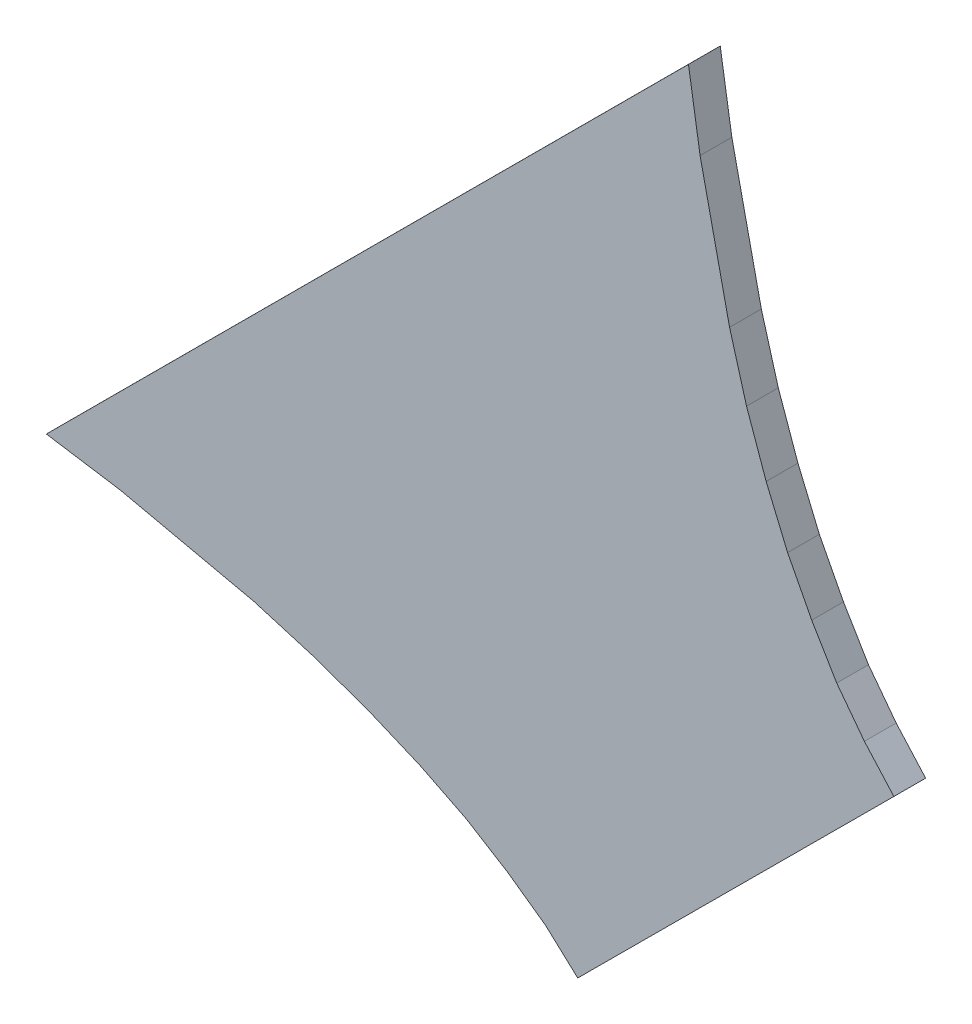
ISO-10303-21;
HEADER;
FILE_DESCRIPTION(('STEP AP214'),'2;1');
FILE_NAME('part.step','',(''),(''),'','','');
FILE_SCHEMA(('AUTOMOTIVE_DESIGN { 1 0 10303 214 1 1 1 1 }'));
ENDSEC;
DATA;
#1=APPLICATION_CONTEXT('core data for automotive mechanical design processes');
#2=APPLICATION_PROTOCOL_DEFINITION('international standard','automotive_design',2000,#1);
#3=PRODUCT_CONTEXT('',#1,'mechanical');
#4=PRODUCT('Part','Part','',(#3));
#5=PRODUCT_RELATED_PRODUCT_CATEGORY('part','',(#4));
#6=PRODUCT_DEFINITION_FORMATION('','',#4);
#7=PRODUCT_DEFINITION_CONTEXT('part definition',#1,'design');
#8=PRODUCT_DEFINITION('design','',#6,#7);
#9=PRODUCT_DEFINITION_SHAPE('','',#8);
#10=(LENGTH_UNIT() NAMED_UNIT(*) SI_UNIT(.MILLI.,.METRE.));
#11=(NAMED_UNIT(*) PLANE_ANGLE_UNIT() SI_UNIT($,.RADIAN.));
#12=(NAMED_UNIT(*) SI_UNIT($,.STERADIAN.) SOLID_ANGLE_UNIT());
#13=UNCERTAINTY_MEASURE_WITH_UNIT(LENGTH_MEASURE(1.E-05),#10,'distance_accuracy_value','');
#14=(GEOMETRIC_REPRESENTATION_CONTEXT(3) GLOBAL_UNCERTAINTY_ASSIGNED_CONTEXT((#13)) GLOBAL_UNIT_ASSIGNED_CONTEXT((#10,
#11,#12)) REPRESENTATION_CONTEXT('',''));
#15=CARTESIAN_POINT('',(0.,0.,0.));
#16=DIRECTION('',(0.,0.,1.));
#17=DIRECTION('',(1.,0.,0.));
#18=AXIS2_PLACEMENT_3D('',#15,#16,#17);
#19=CARTESIAN_POINT('',(46.2589988708496,103.994003295899,0.));
#20=DIRECTION('',(-0.746278904307809,-0.665633380311667,0.));
#21=DIRECTION('',(-0.665633380311667,0.746278904307809,0.));
#22=AXIS2_PLACEMENT_3D('',#19,#20,#21);
#23=PLANE('',#22);
#24=DIRECTION('',(-0.665633380311667,0.746278904307809,0.));
#25=VECTOR('',#24,1.);
#26=CARTESIAN_POINT('',(46.2589988708496,103.994003295898,0.03556));
#27=LINE('',#26,#25);
#28=CARTESIAN_POINT('',(46.2589988708496,103.994003295898,0.03556));
#29=VERTEX_POINT('',#28);
#30=CARTESIAN_POINT('',(46.226001739502,104.030998229981,0.03556));
#31=VERTEX_POINT('',#30);
#32=EDGE_CURVE('E11',#29,#31,#27,.T.);
#33=ORIENTED_EDGE('',*,*,#32,.F.);
#34=DIRECTION('',(0.,0.,1.));
#35=VECTOR('',#34,1.);
#36=CARTESIAN_POINT('',(46.2589988708496,103.994003295898,0.));
#37=LINE('',#36,#35);
#38=CARTESIAN_POINT('',(46.2589988708496,103.994003295898,0.));
#39=VERTEX_POINT('',#38);
#40=EDGE_CURVE('E24',#39,#29,#37,.T.);
#41=ORIENTED_EDGE('',*,*,#40,.F.);
#42=DIRECTION('',(-0.665633380311667,0.746278904307809,0.));
#43=VECTOR('',#42,1.);
#44=CARTESIAN_POINT('',(46.2589988708496,103.994003295898,0.));
#45=LINE('',#44,#43);
#46=CARTESIAN_POINT('',(46.226001739502,104.030998229981,0.));
#47=VERTEX_POINT('',#46);
#48=EDGE_CURVE('E172',#39,#47,#45,.T.);
#49=ORIENTED_EDGE('',*,*,#48,.T.);
#50=DIRECTION('',(0.,0.,1.));
#51=VECTOR('',#50,1.);
#52=CARTESIAN_POINT('',(46.226001739502,104.030998229981,0.));
#53=LINE('',#52,#51);
#54=EDGE_CURVE('E37',#47,#31,#53,.T.);
#55=ORIENTED_EDGE('',*,*,#54,.T.);
#56=EDGE_LOOP('',(#33,#41,#49,#55));
#57=FACE_BOUND('',#56,.T.);
#58=ADVANCED_FACE('F17',(#57),#23,.F.);
#59=CARTESIAN_POINT('',(46.226001739502,104.030998229981,0.));
#60=DIRECTION('',(-0.797642786115411,-0.603130156564937,0.));
#61=DIRECTION('',(-0.603130156564937,0.797642786115411,0.));
#62=AXIS2_PLACEMENT_3D('',#59,#60,#61);
#63=PLANE('',#62);
#64=DIRECTION('',(-0.603130156564937,0.797642786115411,0.));
#65=VECTOR('',#64,1.);
#66=CARTESIAN_POINT('',(46.226001739502,104.030998229981,0.03556));
#67=LINE('',#66,#65);
#68=CARTESIAN_POINT('',(46.1949996948242,104.071998596191,0.03556));
#69=VERTEX_POINT('',#68);
#70=EDGE_CURVE('E308',#31,#69,#67,.T.);
#71=ORIENTED_EDGE('',*,*,#70,.F.);
#72=ORIENTED_EDGE('',*,*,#54,.F.);
#73=DIRECTION('',(-0.603130156564937,0.797642786115411,0.));
#74=VECTOR('',#73,1.);
#75=CARTESIAN_POINT('',(46.226001739502,104.030998229981,0.));
#76=LINE('',#75,#74);
#77=CARTESIAN_POINT('',(46.1949996948242,104.071998596191,0.));
#78=VERTEX_POINT('',#77);
#79=EDGE_CURVE('E305',#47,#78,#76,.T.);
#80=ORIENTED_EDGE('',*,*,#79,.T.);
#81=DIRECTION('',(0.,0.,1.));
#82=VECTOR('',#81,1.);
#83=CARTESIAN_POINT('',(46.1949996948242,104.071998596191,0.));
#84=LINE('',#83,#82);
#85=EDGE_CURVE('E303',#78,#69,#84,.T.);
#86=ORIENTED_EDGE('',*,*,#85,.T.);
#87=EDGE_LOOP('',(#71,#72,#80,#86));
#88=FACE_BOUND('',#87,.T.);
#89=ADVANCED_FACE('F316',(#88),#63,.F.);
#90=CARTESIAN_POINT('',(46.1949996948242,104.071998596191,0.));
#91=DIRECTION('',(-0.859125024674549,-0.511765758895568,0.));
#92=DIRECTION('',(-0.511765758895568,0.859125024674549,0.));
#93=AXIS2_PLACEMENT_3D('',#90,#91,#92);
#94=PLANE('',#93);
#95=DIRECTION('',(-0.511765758895568,0.859125024674549,0.));
#96=VECTOR('',#95,1.);
#97=CARTESIAN_POINT('',(46.1949996948242,104.071998596191,0.03556));
#98=LINE('',#97,#96);
#99=CARTESIAN_POINT('',(46.1669998168945,104.119003295898,0.03556));
#100=VERTEX_POINT('',#99);
#101=EDGE_CURVE('E300',#69,#100,#98,.T.);
#102=ORIENTED_EDGE('',*,*,#101,.F.);
#103=ORIENTED_EDGE('',*,*,#85,.F.);
#104=DIRECTION('',(-0.511765758895568,0.859125024674549,0.));
#105=VECTOR('',#104,1.);
#106=CARTESIAN_POINT('',(46.1949996948242,104.071998596191,0.));
#107=LINE('',#106,#105);
#108=CARTESIAN_POINT('',(46.1669998168945,104.119003295898,0.));
#109=VERTEX_POINT('',#108);
#110=EDGE_CURVE('E297',#78,#109,#107,.T.);
#111=ORIENTED_EDGE('',*,*,#110,.T.);
#112=DIRECTION('',(0.,0.,1.));
#113=VECTOR('',#112,1.);
#114=CARTESIAN_POINT('',(46.1669998168945,104.119003295898,0.));
#115=LINE('',#114,#113);
#116=EDGE_CURVE('E295',#109,#100,#115,.T.);
#117=ORIENTED_EDGE('',*,*,#116,.T.);
#118=EDGE_LOOP('',(#102,#103,#111,#117));
#119=FACE_BOUND('',#118,.T.);
#120=ADVANCED_FACE('F322',(#119),#94,.F.);
#121=CARTESIAN_POINT('',(46.1669998168945,104.119003295899,0.));
#122=DIRECTION('',(-0.887472519354433,-0.460860637710248,0.));
#123=DIRECTION('',(-0.460860637710248,0.887472519354433,0.));
#124=AXIS2_PLACEMENT_3D('',#121,#122,#123);
#125=PLANE('',#124);
#126=DIRECTION('',(-0.460860637710248,0.887472519354433,0.));
#127=VECTOR('',#126,1.);
#128=CARTESIAN_POINT('',(46.1669998168945,104.119003295898,0.03556));
#129=LINE('',#128,#127);
#130=CARTESIAN_POINT('',(46.1399993896484,104.170997619629,0.03556));
#131=VERTEX_POINT('',#130);
#132=EDGE_CURVE('E292',#100,#131,#129,.T.);
#133=ORIENTED_EDGE('',*,*,#132,.F.);
#134=ORIENTED_EDGE('',*,*,#116,.F.);
#135=DIRECTION('',(-0.460860637710248,0.887472519354433,0.));
#136=VECTOR('',#135,1.);
#137=CARTESIAN_POINT('',(46.1669998168945,104.119003295898,0.));
#138=LINE('',#137,#136);
#139=CARTESIAN_POINT('',(46.1399993896484,104.170997619629,0.));
#140=VERTEX_POINT('',#139);
#141=EDGE_CURVE('E289',#109,#140,#138,.T.);
#142=ORIENTED_EDGE('',*,*,#141,.T.);
#143=DIRECTION('',(0.,0.,1.));
#144=VECTOR('',#143,1.);
#145=CARTESIAN_POINT('',(46.1399993896484,104.170997619629,0.));
#146=LINE('',#145,#144);
#147=EDGE_CURVE('E287',#140,#131,#146,.T.);
#148=ORIENTED_EDGE('',*,*,#147,.T.);
#149=EDGE_LOOP('',(#133,#134,#142,#148));
#150=FACE_BOUND('',#149,.T.);
#151=ADVANCED_FACE('F324',(#150),#125,.F.);
#152=CARTESIAN_POINT('',(46.1399993896484,104.170997619629,0.));
#153=DIRECTION('',(-0.921643502367666,-0.388037697322647,0.));
#154=DIRECTION('',(-0.388037697322647,0.921643502367666,0.));
#155=AXIS2_PLACEMENT_3D('',#152,#153,#154);
#156=PLANE('',#155);
#157=DIRECTION('',(-0.388037697322647,0.921643502367666,0.));
#158=VECTOR('',#157,1.);
#159=CARTESIAN_POINT('',(46.1399993896484,104.170997619629,0.03556));
#160=LINE('',#159,#158);
#161=CARTESIAN_POINT('',(46.1160011291504,104.227996826172,0.03556));
#162=VERTEX_POINT('',#161);
#163=EDGE_CURVE('E284',#131,#162,#160,.T.);
#164=ORIENTED_EDGE('',*,*,#163,.F.);
#165=ORIENTED_EDGE('',*,*,#147,.F.);
#166=DIRECTION('',(-0.388037697322647,0.921643502367666,0.));
#167=VECTOR('',#166,1.);
#168=CARTESIAN_POINT('',(46.1399993896484,104.170997619629,0.));
#169=LINE('',#168,#167);
#170=CARTESIAN_POINT('',(46.1160011291504,104.227996826172,0.));
#171=VERTEX_POINT('',#170);
#172=EDGE_CURVE('E281',#140,#171,#169,.T.);
#173=ORIENTED_EDGE('',*,*,#172,.T.);
#174=DIRECTION('',(0.,0.,1.));
#175=VECTOR('',#174,1.);
#176=CARTESIAN_POINT('',(46.1160011291504,104.227996826172,0.));
#177=LINE('',#176,#175);
#178=EDGE_CURVE('E279',#171,#162,#177,.T.);
#179=ORIENTED_EDGE('',*,*,#178,.T.);
#180=EDGE_LOOP('',(#164,#165,#173,#179));
#181=FACE_BOUND('',#180,.T.);
#182=ADVANCED_FACE('F329',(#181),#156,.F.);
#183=CARTESIAN_POINT('',(46.1160011291504,104.227996826172,0.));
#184=DIRECTION('',(-0.942437765959114,-0.334381604299631,0.));
#185=DIRECTION('',(-0.334381604299631,0.942437765959114,0.));
#186=AXIS2_PLACEMENT_3D('',#183,#184,#185);
#187=PLANE('',#186);
#188=DIRECTION('',(-0.334381604299631,0.942437765959114,0.));
#189=VECTOR('',#188,1.);
#190=CARTESIAN_POINT('',(46.1160011291504,104.227996826172,0.03556));
#191=LINE('',#190,#189);
#192=CARTESIAN_POINT('',(46.0940017700195,104.290000915527,0.03556));
#193=VERTEX_POINT('',#192);
#194=EDGE_CURVE('E276',#162,#193,#191,.T.);
#195=ORIENTED_EDGE('',*,*,#194,.F.);
#196=ORIENTED_EDGE('',*,*,#178,.F.);
#197=DIRECTION('',(-0.334381604299631,0.942437765959114,0.));
#198=VECTOR('',#197,1.);
#199=CARTESIAN_POINT('',(46.1160011291504,104.227996826172,0.));
#200=LINE('',#199,#198);
#201=CARTESIAN_POINT('',(46.0940017700195,104.290000915527,0.));
#202=VERTEX_POINT('',#201);
#203=EDGE_CURVE('E273',#171,#202,#200,.T.);
#204=ORIENTED_EDGE('',*,*,#203,.T.);
#205=DIRECTION('',(0.,0.,1.));
#206=VECTOR('',#205,1.);
#207=CARTESIAN_POINT('',(46.0940017700195,104.290000915527,0.));
#208=LINE('',#207,#206);
#209=EDGE_CURVE('E271',#202,#193,#208,.T.);
#210=ORIENTED_EDGE('',*,*,#209,.T.);
#211=EDGE_LOOP('',(#195,#196,#204,#210));
#212=FACE_BOUND('',#211,.T.);
#213=ADVANCED_FACE('F332',(#212),#187,.F.);
#214=CARTESIAN_POINT('',(46.0940017700195,104.290000915527,0.));
#215=DIRECTION('',(-0.962061572120562,-0.27283242374929,0.));
#216=DIRECTION('',(-0.27283242374929,0.962061572120562,0.));
#217=AXIS2_PLACEMENT_3D('',#214,#215,#216);
#218=PLANE('',#217);
#219=DIRECTION('',(-0.27283242374929,0.962061572120562,0.));
#220=VECTOR('',#219,1.);
#221=CARTESIAN_POINT('',(46.0940017700195,104.290000915527,0.03556));
#222=LINE('',#221,#220);
#223=CARTESIAN_POINT('',(46.0750007629395,104.357002258301,0.03556));
#224=VERTEX_POINT('',#223);
#225=EDGE_CURVE('E268',#193,#224,#222,.T.);
#226=ORIENTED_EDGE('',*,*,#225,.F.);
#227=ORIENTED_EDGE('',*,*,#209,.F.);
#228=DIRECTION('',(-0.27283242374929,0.962061572120562,0.));
#229=VECTOR('',#228,1.);
#230=CARTESIAN_POINT('',(46.0940017700195,104.290000915527,0.));
#231=LINE('',#230,#229);
#232=CARTESIAN_POINT('',(46.0750007629395,104.357002258301,0.));
#233=VERTEX_POINT('',#232);
#234=EDGE_CURVE('E265',#202,#233,#231,.T.);
#235=ORIENTED_EDGE('',*,*,#234,.T.);
#236=DIRECTION('',(0.,0.,1.));
#237=VECTOR('',#236,1.);
#238=CARTESIAN_POINT('',(46.0750007629395,104.357002258301,0.));
#239=LINE('',#238,#237);
#240=EDGE_CURVE('E263',#233,#224,#239,.T.);
#241=ORIENTED_EDGE('',*,*,#240,.T.);
#242=EDGE_LOOP('',(#226,#227,#235,#241));
#243=FACE_BOUND('',#242,.T.);
#244=ADVANCED_FACE('F337',(#243),#218,.F.);
#245=CARTESIAN_POINT('',(46.0750007629395,104.357002258301,0.));
#246=DIRECTION('',(-0.976643632793507,-0.214865573147262,0.));
#247=DIRECTION('',(-0.214865573147262,0.976643632793507,0.));
#248=AXIS2_PLACEMENT_3D('',#245,#246,#247);
#249=PLANE('',#248);
#250=DIRECTION('',(-0.214865573147262,0.976643632793507,0.));
#251=VECTOR('',#250,1.);
#252=CARTESIAN_POINT('',(46.0750007629395,104.357002258301,0.03556));
#253=LINE('',#252,#251);
#254=CARTESIAN_POINT('',(46.0419998168945,104.50700378418,0.03556));
#255=VERTEX_POINT('',#254);
#256=EDGE_CURVE('E260',#224,#255,#253,.T.);
#257=ORIENTED_EDGE('',*,*,#256,.F.);
#258=ORIENTED_EDGE('',*,*,#240,.F.);
#259=DIRECTION('',(-0.214865573147262,0.976643632793507,0.));
#260=VECTOR('',#259,1.);
#261=CARTESIAN_POINT('',(46.0750007629395,104.357002258301,0.));
#262=LINE('',#261,#260);
#263=CARTESIAN_POINT('',(46.0419998168945,104.50700378418,0.));
#264=VERTEX_POINT('',#263);
#265=EDGE_CURVE('E257',#233,#264,#262,.T.);
#266=ORIENTED_EDGE('',*,*,#265,.T.);
#267=DIRECTION('',(0.,0.,1.));
#268=VECTOR('',#267,1.);
#269=CARTESIAN_POINT('',(46.0419998168945,104.50700378418,0.));
#270=LINE('',#269,#268);
#271=EDGE_CURVE('E255',#264,#255,#270,.T.);
#272=ORIENTED_EDGE('',*,*,#271,.T.);
#273=EDGE_LOOP('',(#257,#258,#266,#272));
#274=FACE_BOUND('',#273,.T.);
#275=ADVANCED_FACE('F340',(#274),#249,.F.);
#276=CARTESIAN_POINT('',(46.0419998168945,104.50700378418,0.));
#277=DIRECTION('',(-0.98766216531375,-0.156599639871092,0.));
#278=DIRECTION('',(-0.156599639871092,0.98766216531375,0.));
#279=AXIS2_PLACEMENT_3D('',#276,#277,#278);
#280=PLANE('',#279);
#281=DIRECTION('',(-0.156599639871092,0.98766216531375,0.));
#282=VECTOR('',#281,1.);
#283=CARTESIAN_POINT('',(46.0419998168945,104.50700378418,0.03556));
#284=LINE('',#283,#282);
#285=CARTESIAN_POINT('',(46.0289993286133,104.588996887207,0.03556));
#286=VERTEX_POINT('',#285);
#287=EDGE_CURVE('E252',#255,#286,#284,.T.);
#288=ORIENTED_EDGE('',*,*,#287,.F.);
#289=ORIENTED_EDGE('',*,*,#271,.F.);
#290=DIRECTION('',(-0.156599639871092,0.98766216531375,0.));
#291=VECTOR('',#290,1.);
#292=CARTESIAN_POINT('',(46.0419998168945,104.50700378418,0.));
#293=LINE('',#292,#291);
#294=CARTESIAN_POINT('',(46.0289993286133,104.588996887207,0.));
#295=VERTEX_POINT('',#294);
#296=EDGE_CURVE('E249',#264,#295,#293,.T.);
#297=ORIENTED_EDGE('',*,*,#296,.T.);
#298=DIRECTION('',(0.,0.,1.));
#299=VECTOR('',#298,1.);
#300=CARTESIAN_POINT('',(46.0289993286133,104.588996887207,0.));
#301=LINE('',#300,#299);
#302=EDGE_CURVE('E247',#295,#286,#301,.T.);
#303=ORIENTED_EDGE('',*,*,#302,.T.);
#304=EDGE_LOOP('',(#288,#289,#297,#303));
#305=FACE_BOUND('',#304,.T.);
#306=ADVANCED_FACE('F345',(#305),#280,.F.);
#307=CARTESIAN_POINT('',(46.0289993286133,104.588996887207,0.));
#308=DIRECTION('',(0.706612928117822,-0.707600289582161,0.));
#309=DIRECTION('',(-0.707600289582161,-0.706612928117822,0.));
#310=AXIS2_PLACEMENT_3D('',#307,#308,#309);
#311=PLANE('',#310);
#312=DIRECTION('',(-0.707600289582161,-0.706612928117822,0.));
#313=VECTOR('',#312,1.);
#314=CARTESIAN_POINT('',(46.0289993286133,104.588996887207,0.03556));
#315=LINE('',#314,#313);
#316=CARTESIAN_POINT('',(45.310001373291,103.871002197266,0.03556));
#317=VERTEX_POINT('',#316);
#318=EDGE_CURVE('E244',#286,#317,#315,.T.);
#319=ORIENTED_EDGE('',*,*,#318,.F.);
#320=ORIENTED_EDGE('',*,*,#302,.F.);
#321=DIRECTION('',(-0.707600289582161,-0.706612928117822,0.));
#322=VECTOR('',#321,1.);
#323=CARTESIAN_POINT('',(46.0289993286133,104.588996887207,0.));
#324=LINE('',#323,#322);
#325=CARTESIAN_POINT('',(45.310001373291,103.871002197266,0.));
#326=VERTEX_POINT('',#325);
#327=EDGE_CURVE('E241',#295,#326,#324,.T.);
#328=ORIENTED_EDGE('',*,*,#327,.T.);
#329=DIRECTION('',(0.,0.,1.));
#330=VECTOR('',#329,1.);
#331=CARTESIAN_POINT('',(45.310001373291,103.871002197266,0.));
#332=LINE('',#331,#330);
#333=EDGE_CURVE('E239',#326,#317,#332,.T.);
#334=ORIENTED_EDGE('',*,*,#333,.T.);
#335=EDGE_LOOP('',(#319,#320,#328,#334));
#336=FACE_BOUND('',#335,.T.);
#337=ADVANCED_FACE('F348',(#336),#311,.F.);
#338=CARTESIAN_POINT('',(45.310001373291,103.871002197266,0.));
#339=DIRECTION('',(0.15474531571406,0.987954395336422,0.));
#340=DIRECTION('',(0.987954395336422,-0.15474531571406,0.));
#341=AXIS2_PLACEMENT_3D('',#338,#339,#340);
#342=PLANE('',#341);
#343=DIRECTION('',(0.987954395336422,-0.15474531571406,0.));
#344=VECTOR('',#343,1.);
#345=CARTESIAN_POINT('',(45.310001373291,103.871002197266,0.03556));
#346=LINE('',#345,#344);
#347=CARTESIAN_POINT('',(45.3930015563965,103.858001708984,0.03556));
#348=VERTEX_POINT('',#347);
#349=EDGE_CURVE('E236',#317,#348,#346,.T.);
#350=ORIENTED_EDGE('',*,*,#349,.F.);
#351=ORIENTED_EDGE('',*,*,#333,.F.);
#352=DIRECTION('',(0.987954395336422,-0.15474531571406,0.));
#353=VECTOR('',#352,1.);
#354=CARTESIAN_POINT('',(45.310001373291,103.871002197266,0.));
#355=LINE('',#354,#353);
#356=CARTESIAN_POINT('',(45.3930015563965,103.858001708984,0.));
#357=VERTEX_POINT('',#356);
#358=EDGE_CURVE('E233',#326,#357,#355,.T.);
#359=ORIENTED_EDGE('',*,*,#358,.T.);
#360=DIRECTION('',(0.,0.,1.));
#361=VECTOR('',#360,1.);
#362=CARTESIAN_POINT('',(45.3930015563965,103.858001708984,0.));
#363=LINE('',#362,#361);
#364=EDGE_CURVE('E231',#357,#348,#363,.T.);
#365=ORIENTED_EDGE('',*,*,#364,.T.);
#366=EDGE_LOOP('',(#350,#351,#359,#365));
#367=FACE_BOUND('',#366,.T.);
#368=ADVANCED_FACE('F353',(#367),#342,.F.);
#369=CARTESIAN_POINT('',(45.3930015563965,103.858001708984,0.));
#370=DIRECTION('',(0.216268738923542,0.976333873510707,0.));
#371=DIRECTION('',(0.976333873510707,-0.216268738923542,0.));
#372=AXIS2_PLACEMENT_3D('',#369,#370,#371);
#373=PLANE('',#372);
#374=DIRECTION('',(0.976333873510707,-0.216268738923542,0.));
#375=VECTOR('',#374,1.);
#376=CARTESIAN_POINT('',(45.3930015563965,103.858001708984,0.03556));
#377=LINE('',#376,#375);
#378=CARTESIAN_POINT('',(45.5419998168945,103.824996948242,0.03556));
#379=VERTEX_POINT('',#378);
#380=EDGE_CURVE('E228',#348,#379,#377,.T.);
#381=ORIENTED_EDGE('',*,*,#380,.F.);
#382=ORIENTED_EDGE('',*,*,#364,.F.);
#383=DIRECTION('',(0.976333873510707,-0.216268738923542,0.));
#384=VECTOR('',#383,1.);
#385=CARTESIAN_POINT('',(45.3930015563965,103.858001708984,0.));
#386=LINE('',#385,#384);
#387=CARTESIAN_POINT('',(45.5419998168945,103.824996948242,0.));
#388=VERTEX_POINT('',#387);
#389=EDGE_CURVE('E225',#357,#388,#386,.T.);
#390=ORIENTED_EDGE('',*,*,#389,.T.);
#391=DIRECTION('',(0.,0.,1.));
#392=VECTOR('',#391,1.);
#393=CARTESIAN_POINT('',(45.5419998168945,103.824996948242,0.));
#394=LINE('',#393,#392);
#395=EDGE_CURVE('E223',#388,#379,#394,.T.);
#396=ORIENTED_EDGE('',*,*,#395,.T.);
#397=EDGE_LOOP('',(#381,#382,#390,#396));
#398=FACE_BOUND('',#397,.T.);
#399=ADVANCED_FACE('F356',(#398),#373,.F.);
#400=CARTESIAN_POINT('',(45.5419998168945,103.824996948242,0.));
#401=DIRECTION('',(0.285986180602538,0.958233742102819,0.));
#402=DIRECTION('',(0.958233742102819,-0.285986180602538,0.));
#403=AXIS2_PLACEMENT_3D('',#400,#401,#402);
#404=PLANE('',#403);
#405=DIRECTION('',(0.958233742102819,-0.285986180602538,0.));
#406=VECTOR('',#405,1.);
#407=CARTESIAN_POINT('',(45.5419998168945,103.824996948242,0.03556));
#408=LINE('',#407,#406);
#409=CARTESIAN_POINT('',(45.609001159668,103.805000305176,0.03556));
#410=VERTEX_POINT('',#409);
#411=EDGE_CURVE('E220',#379,#410,#408,.T.);
#412=ORIENTED_EDGE('',*,*,#411,.F.);
#413=ORIENTED_EDGE('',*,*,#395,.F.);
#414=DIRECTION('',(0.958233742102819,-0.285986180602538,0.));
#415=VECTOR('',#414,1.);
#416=CARTESIAN_POINT('',(45.5419998168945,103.824996948242,0.));
#417=LINE('',#416,#415);
#418=CARTESIAN_POINT('',(45.609001159668,103.805000305176,0.));
#419=VERTEX_POINT('',#418);
#420=EDGE_CURVE('E217',#388,#419,#417,.T.);
#421=ORIENTED_EDGE('',*,*,#420,.T.);
#422=DIRECTION('',(0.,0.,1.));
#423=VECTOR('',#422,1.);
#424=CARTESIAN_POINT('',(45.609001159668,103.805000305176,0.));
#425=LINE('',#424,#423);
#426=EDGE_CURVE('E215',#419,#410,#425,.T.);
#427=ORIENTED_EDGE('',*,*,#426,.T.);
#428=EDGE_LOOP('',(#412,#413,#421,#427));
#429=FACE_BOUND('',#428,.T.);
#430=ADVANCED_FACE('F361',(#429),#404,.F.);
#431=CARTESIAN_POINT('',(45.609001159668,103.805000305176,0.));
#432=DIRECTION('',(0.334451376782231,0.94241300742746,0.));
#433=DIRECTION('',(0.94241300742746,-0.334451376782231,0.));
#434=AXIS2_PLACEMENT_3D('',#431,#432,#433);
#435=PLANE('',#434);
#436=DIRECTION('',(0.94241300742746,-0.33445137678223,0.));
#437=VECTOR('',#436,1.);
#438=CARTESIAN_POINT('',(45.609001159668,103.805000305176,0.03556));
#439=LINE('',#438,#437);
#440=CARTESIAN_POINT('',(45.6710014343262,103.782997131348,0.03556));
#441=VERTEX_POINT('',#440);
#442=EDGE_CURVE('E212',#410,#441,#439,.T.);
#443=ORIENTED_EDGE('',*,*,#442,.F.);
#444=ORIENTED_EDGE('',*,*,#426,.F.);
#445=DIRECTION('',(0.94241300742746,-0.33445137678223,0.));
#446=VECTOR('',#445,1.);
#447=CARTESIAN_POINT('',(45.609001159668,103.805000305176,0.));
#448=LINE('',#447,#446);
#449=CARTESIAN_POINT('',(45.6710014343262,103.782997131348,0.));
#450=VERTEX_POINT('',#449);
#451=EDGE_CURVE('E209',#419,#450,#448,.T.);
#452=ORIENTED_EDGE('',*,*,#451,.T.);
#453=DIRECTION('',(0.,0.,1.));
#454=VECTOR('',#453,1.);
#455=CARTESIAN_POINT('',(45.6710014343262,103.782997131348,0.));
#456=LINE('',#455,#454);
#457=EDGE_CURVE('E207',#450,#441,#456,.T.);
#458=ORIENTED_EDGE('',*,*,#457,.T.);
#459=EDGE_LOOP('',(#443,#444,#452,#458));
#460=FACE_BOUND('',#459,.T.);
#461=ADVANCED_FACE('F364',(#460),#435,.F.);
#462=CARTESIAN_POINT('',(45.6710014343262,103.782997131348,0.));
#463=DIRECTION('',(0.387985301609428,0.921665560675369,0.));
#464=DIRECTION('',(0.921665560675369,-0.387985301609428,0.));
#465=AXIS2_PLACEMENT_3D('',#462,#463,#464);
#466=PLANE('',#465);
#467=DIRECTION('',(0.921665560675369,-0.387985301609428,0.));
#468=VECTOR('',#467,1.);
#469=CARTESIAN_POINT('',(45.6710014343262,103.782997131348,0.03556));
#470=LINE('',#469,#468);
#471=CARTESIAN_POINT('',(45.7280006408691,103.759002685547,0.03556));
#472=VERTEX_POINT('',#471);
#473=EDGE_CURVE('E204',#441,#472,#470,.T.);
#474=ORIENTED_EDGE('',*,*,#473,.F.);
#475=ORIENTED_EDGE('',*,*,#457,.F.);
#476=DIRECTION('',(0.921665560675369,-0.387985301609428,0.));
#477=VECTOR('',#476,1.);
#478=CARTESIAN_POINT('',(45.6710014343262,103.782997131348,0.));
#479=LINE('',#478,#477);
#480=CARTESIAN_POINT('',(45.7280006408691,103.759002685547,0.));
#481=VERTEX_POINT('',#480);
#482=EDGE_CURVE('E201',#450,#481,#479,.T.);
#483=ORIENTED_EDGE('',*,*,#482,.T.);
#484=DIRECTION('',(0.,0.,1.));
#485=VECTOR('',#484,1.);
#486=CARTESIAN_POINT('',(45.7280006408691,103.759002685547,0.));
#487=LINE('',#486,#485);
#488=EDGE_CURVE('E199',#481,#472,#487,.T.);
#489=ORIENTED_EDGE('',*,*,#488,.T.);
#490=EDGE_LOOP('',(#474,#475,#483,#489));
#491=FACE_BOUND('',#490,.T.);
#492=ADVANCED_FACE('F369',(#491),#466,.F.);
#493=CARTESIAN_POINT('',(45.7280006408691,103.759002685547,0.));
#494=DIRECTION('',(0.447239841776999,0.894414067380028,0.));
#495=DIRECTION('',(0.894414067380028,-0.447239841776999,0.));
#496=AXIS2_PLACEMENT_3D('',#493,#494,#495);
#497=PLANE('',#496);
#498=DIRECTION('',(0.894414067380028,-0.447239841776999,0.));
#499=VECTOR('',#498,1.);
#500=CARTESIAN_POINT('',(45.7280006408691,103.759002685547,0.03556));
#501=LINE('',#500,#499);
#502=CARTESIAN_POINT('',(45.7799987792969,103.733001708984,0.03556));
#503=VERTEX_POINT('',#502);
#504=EDGE_CURVE('E196',#472,#503,#501,.T.);
#505=ORIENTED_EDGE('',*,*,#504,.F.);
#506=ORIENTED_EDGE('',*,*,#488,.F.);
#507=DIRECTION('',(0.894414067380028,-0.447239841776999,0.));
#508=VECTOR('',#507,1.);
#509=CARTESIAN_POINT('',(45.7280006408691,103.759002685547,0.));
#510=LINE('',#509,#508);
#511=CARTESIAN_POINT('',(45.7799987792969,103.733001708984,0.));
#512=VERTEX_POINT('',#511);
#513=EDGE_CURVE('E193',#481,#512,#510,.T.);
#514=ORIENTED_EDGE('',*,*,#513,.T.);
#515=DIRECTION('',(0.,0.,1.));
#516=VECTOR('',#515,1.);
#517=CARTESIAN_POINT('',(45.7799987792969,103.733001708984,0.));
#518=LINE('',#517,#516);
#519=EDGE_CURVE('E191',#512,#503,#518,.T.);
#520=ORIENTED_EDGE('',*,*,#519,.T.);
#521=EDGE_LOOP('',(#505,#506,#514,#520));
#522=FACE_BOUND('',#521,.T.);
#523=ADVANCED_FACE('F372',(#522),#497,.F.);
#524=CARTESIAN_POINT('',(45.7799987792969,103.733001708984,0.));
#525=DIRECTION('',(0.525091360948296,0.851045864015252,0.));
#526=DIRECTION('',(0.851045864015252,-0.525091360948296,0.));
#527=AXIS2_PLACEMENT_3D('',#524,#525,#526);
#528=PLANE('',#527);
#529=DIRECTION('',(0.851045864015252,-0.525091360948295,0.));
#530=VECTOR('',#529,1.);
#531=CARTESIAN_POINT('',(45.7799987792969,103.733001708984,0.03556));
#532=LINE('',#531,#530);
#533=CARTESIAN_POINT('',(45.8269996643066,103.704002380371,0.03556));
#534=VERTEX_POINT('',#533);
#535=EDGE_CURVE('E188',#503,#534,#532,.T.);
#536=ORIENTED_EDGE('',*,*,#535,.F.);
#537=ORIENTED_EDGE('',*,*,#519,.F.);
#538=DIRECTION('',(0.851045864015252,-0.525091360948295,0.));
#539=VECTOR('',#538,1.);
#540=CARTESIAN_POINT('',(45.7799987792969,103.733001708984,0.));
#541=LINE('',#540,#539);
#542=CARTESIAN_POINT('',(45.8269996643066,103.704002380371,0.));
#543=VERTEX_POINT('',#542);
#544=EDGE_CURVE('E185',#512,#543,#541,.T.);
#545=ORIENTED_EDGE('',*,*,#544,.T.);
#546=DIRECTION('',(0.,0.,1.));
#547=VECTOR('',#546,1.);
#548=CARTESIAN_POINT('',(45.8269996643066,103.704002380371,0.));
#549=LINE('',#548,#547);
#550=EDGE_CURVE('E183',#543,#534,#549,.T.);
#551=ORIENTED_EDGE('',*,*,#550,.T.);
#552=EDGE_LOOP('',(#536,#537,#545,#551));
#553=FACE_BOUND('',#552,.T.);
#554=ADVANCED_FACE('F377',(#553),#528,.F.);
#555=CARTESIAN_POINT('',(45.8269996643067,103.704002380371,0.));
#556=DIRECTION('',(0.581224210757245,0.813743458855196,0.));
#557=DIRECTION('',(0.813743458855196,-0.581224210757245,0.));
#558=AXIS2_PLACEMENT_3D('',#555,#556,#557);
#559=PLANE('',#558);
#560=DIRECTION('',(0.813743458855196,-0.581224210757245,0.));
#561=VECTOR('',#560,1.);
#562=CARTESIAN_POINT('',(45.8269996643066,103.704002380371,0.03556));
#563=LINE('',#562,#561);
#564=CARTESIAN_POINT('',(45.8689994812012,103.674003601074,0.03556));
#565=VERTEX_POINT('',#564);
#566=EDGE_CURVE('E180',#534,#565,#563,.T.);
#567=ORIENTED_EDGE('',*,*,#566,.F.);
#568=ORIENTED_EDGE('',*,*,#550,.F.);
#569=DIRECTION('',(0.813743458855196,-0.581224210757245,0.));
#570=VECTOR('',#569,1.);
#571=CARTESIAN_POINT('',(45.8269996643066,103.704002380371,0.));
#572=LINE('',#571,#570);
#573=CARTESIAN_POINT('',(45.8689994812012,103.674003601074,0.));
#574=VERTEX_POINT('',#573);
#575=EDGE_CURVE('E178',#543,#574,#572,.T.);
#576=ORIENTED_EDGE('',*,*,#575,.T.);
#577=DIRECTION('',(0.,0.,1.));
#578=VECTOR('',#577,1.);
#579=CARTESIAN_POINT('',(45.8689994812012,103.674003601074,0.));
#580=LINE('',#579,#578);
#581=EDGE_CURVE('E163',#574,#565,#580,.T.);
#582=ORIENTED_EDGE('',*,*,#581,.T.);
#583=EDGE_LOOP('',(#567,#568,#576,#582));
#584=FACE_BOUND('',#583,.T.);
#585=ADVANCED_FACE('F379',(#584),#559,.F.);
#586=CARTESIAN_POINT('',(45.8689994812012,103.674003601074,0.));
#587=DIRECTION('',(0.675784754188336,0.73709902048952,0.));
#588=DIRECTION('',(0.73709902048952,-0.675784754188336,0.));
#589=AXIS2_PLACEMENT_3D('',#586,#587,#588);
#590=PLANE('',#589);
#591=DIRECTION('',(0.73709902048952,-0.675784754188336,0.));
#592=VECTOR('',#591,1.);
#593=CARTESIAN_POINT('',(45.8689994812012,103.674003601074,0.03556));
#594=LINE('',#593,#592);
#595=CARTESIAN_POINT('',(45.9049987792969,103.640998840332,0.03556));
#596=VERTEX_POINT('',#595);
#597=EDGE_CURVE('E167',#565,#596,#594,.T.);
#598=ORIENTED_EDGE('',*,*,#597,.F.);
#599=ORIENTED_EDGE('',*,*,#581,.F.);
#600=DIRECTION('',(0.73709902048952,-0.675784754188336,0.));
#601=VECTOR('',#600,1.);
#602=CARTESIAN_POINT('',(45.8689994812012,103.674003601074,0.));
#603=LINE('',#602,#601);
#604=CARTESIAN_POINT('',(45.9049987792969,103.640998840332,0.));
#605=VERTEX_POINT('',#604);
#606=EDGE_CURVE('E159',#574,#605,#603,.T.);
#607=ORIENTED_EDGE('',*,*,#606,.T.);
#608=DIRECTION('',(0.,0.,1.));
#609=VECTOR('',#608,1.);
#610=CARTESIAN_POINT('',(45.9049987792969,103.640998840332,0.));
#611=LINE('',#610,#609);
#612=EDGE_CURVE('E149',#605,#596,#611,.T.);
#613=ORIENTED_EDGE('',*,*,#612,.T.);
#614=EDGE_LOOP('',(#598,#599,#607,#613));
#615=FACE_BOUND('',#614,.T.);
#616=ADVANCED_FACE('F162',(#615),#590,.F.);
#617=CARTESIAN_POINT('',(45.9049987792969,103.640998840332,0.));
#618=DIRECTION('',(-0.706110301066655,0.708101859005862,0.));
#619=DIRECTION('',(0.708101859005862,0.706110301066655,0.));
#620=AXIS2_PLACEMENT_3D('',#617,#618,#619);
#621=PLANE('',#620);
#622=DIRECTION('',(0.708101859005862,0.706110301066655,0.));
#623=VECTOR('',#622,1.);
#624=CARTESIAN_POINT('',(45.9049987792969,103.640998840332,0.03556));
#625=LINE('',#624,#623);
#626=EDGE_CURVE('E155',#596,#29,#625,.T.);
#627=ORIENTED_EDGE('',*,*,#626,.F.);
#628=ORIENTED_EDGE('',*,*,#612,.F.);
#629=DIRECTION('',(0.708101859005862,0.706110301066655,0.));
#630=VECTOR('',#629,1.);
#631=CARTESIAN_POINT('',(45.9049987792969,103.640998840332,0.));
#632=LINE('',#631,#630);
#633=EDGE_CURVE('E153',#605,#39,#632,.T.);
#634=ORIENTED_EDGE('',*,*,#633,.T.);
#635=ORIENTED_EDGE('',*,*,#40,.T.);
#636=EDGE_LOOP('',(#627,#628,#634,#635));
#637=FACE_BOUND('',#636,.T.);
#638=ADVANCED_FACE('F151',(#637),#621,.F.);
#639=CARTESIAN_POINT('',(46.2589988708496,103.994003295899,0.));
#640=DIRECTION('',(0.,0.,1.));
#641=DIRECTION('',(1.,0.,0.));
#642=AXIS2_PLACEMENT_3D('',#639,#640,#641);
#643=PLANE('',#642);
#644=ORIENTED_EDGE('',*,*,#633,.F.);
#645=ORIENTED_EDGE('',*,*,#606,.F.);
#646=ORIENTED_EDGE('',*,*,#575,.F.);
#647=ORIENTED_EDGE('',*,*,#544,.F.);
#648=ORIENTED_EDGE('',*,*,#513,.F.);
#649=ORIENTED_EDGE('',*,*,#482,.F.);
#650=ORIENTED_EDGE('',*,*,#451,.F.);
#651=ORIENTED_EDGE('',*,*,#420,.F.);
#652=ORIENTED_EDGE('',*,*,#389,.F.);
#653=ORIENTED_EDGE('',*,*,#358,.F.);
#654=ORIENTED_EDGE('',*,*,#327,.F.);
#655=ORIENTED_EDGE('',*,*,#296,.F.);
#656=ORIENTED_EDGE('',*,*,#265,.F.);
#657=ORIENTED_EDGE('',*,*,#234,.F.);
#658=ORIENTED_EDGE('',*,*,#203,.F.);
#659=ORIENTED_EDGE('',*,*,#172,.F.);
#660=ORIENTED_EDGE('',*,*,#141,.F.);
#661=ORIENTED_EDGE('',*,*,#110,.F.);
#662=ORIENTED_EDGE('',*,*,#79,.F.);
#663=ORIENTED_EDGE('',*,*,#48,.F.);
#664=EDGE_LOOP('',(#644,#645,#646,#647,#648,#649,#650,#651,#652,#653,#654,#655,#656,#657,#658,
#659,#660,#661,#662,#663));
#665=FACE_BOUND('',#664,.T.);
#666=ADVANCED_FACE('F170',(#665),#643,.F.);
#667=CARTESIAN_POINT('',(46.2589988708496,103.994003295899,0.03556));
#668=DIRECTION('',(0.,0.,1.));
#669=DIRECTION('',(1.,0.,0.));
#670=AXIS2_PLACEMENT_3D('',#667,#668,#669);
#671=PLANE('',#670);
#672=ORIENTED_EDGE('',*,*,#32,.T.);
#673=ORIENTED_EDGE('',*,*,#70,.T.);
#674=ORIENTED_EDGE('',*,*,#101,.T.);
#675=ORIENTED_EDGE('',*,*,#132,.T.);
#676=ORIENTED_EDGE('',*,*,#163,.T.);
#677=ORIENTED_EDGE('',*,*,#194,.T.);
#678=ORIENTED_EDGE('',*,*,#225,.T.);
#679=ORIENTED_EDGE('',*,*,#256,.T.);
#680=ORIENTED_EDGE('',*,*,#287,.T.);
#681=ORIENTED_EDGE('',*,*,#318,.T.);
#682=ORIENTED_EDGE('',*,*,#349,.T.);
#683=ORIENTED_EDGE('',*,*,#380,.T.);
#684=ORIENTED_EDGE('',*,*,#411,.T.);
#685=ORIENTED_EDGE('',*,*,#442,.T.);
#686=ORIENTED_EDGE('',*,*,#473,.T.);
#687=ORIENTED_EDGE('',*,*,#504,.T.);
#688=ORIENTED_EDGE('',*,*,#535,.T.);
#689=ORIENTED_EDGE('',*,*,#566,.T.);
#690=ORIENTED_EDGE('',*,*,#597,.T.);
#691=ORIENTED_EDGE('',*,*,#626,.T.);
#692=EDGE_LOOP('',(#672,#673,#674,#675,#676,#677,#678,#679,#680,#681,#682,#683,#684,#685,#686,
#687,#688,#689,#690,#691));
#693=FACE_BOUND('',#692,.T.);
#694=ADVANCED_FACE('F319',(#693),#671,.T.);
#695=CLOSED_SHELL('',(#58,#89,#120,#151,#182,#213,#244,#275,#306,#337,#368,#399,#430,#461,#492,
#523,#554,#585,#616,#638,#666,#694));
#696=MANIFOLD_SOLID_BREP('B1',#695);
#697=ADVANCED_BREP_SHAPE_REPRESENTATION('',(#18,#696),#14);
#698=SHAPE_DEFINITION_REPRESENTATION(#9,#697);
ENDSEC;
END-ISO-10303-21;
